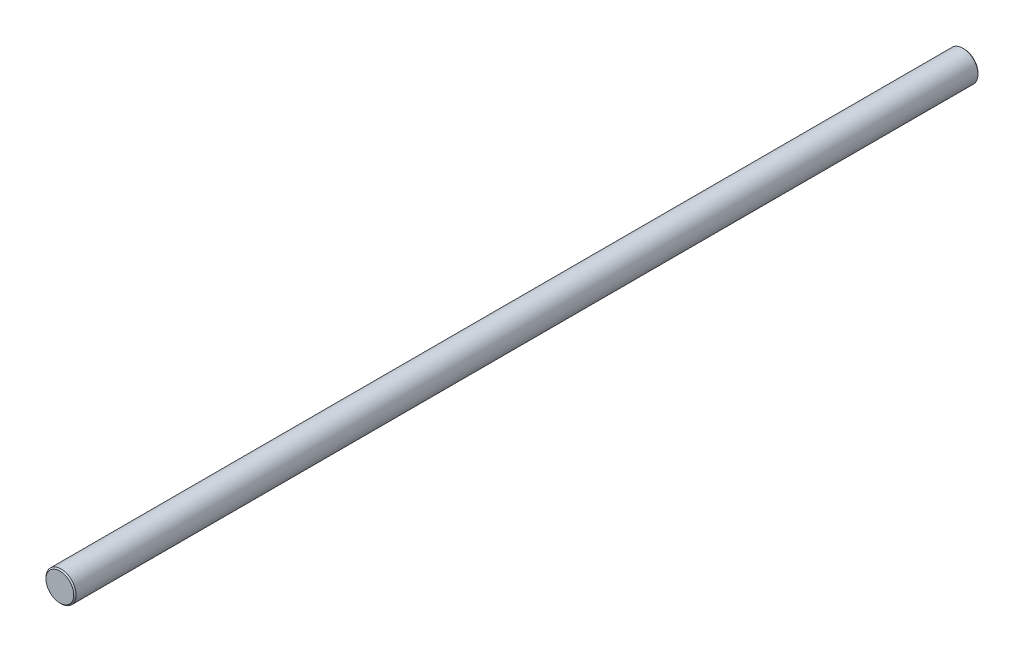
ISO-10303-21;
HEADER;
FILE_DESCRIPTION(('STEP AP214'),'2;1');
FILE_NAME('part.step','',(''),(''),'','','');
FILE_SCHEMA(('AUTOMOTIVE_DESIGN { 1 0 10303 214 1 1 1 1 }'));
ENDSEC;
DATA;
#1=APPLICATION_CONTEXT('core data for automotive mechanical design processes');
#2=APPLICATION_PROTOCOL_DEFINITION('international standard','automotive_design',2000,#1);
#3=PRODUCT_CONTEXT('',#1,'mechanical');
#4=PRODUCT('Part','Part','',(#3));
#5=PRODUCT_RELATED_PRODUCT_CATEGORY('part','',(#4));
#6=PRODUCT_DEFINITION_FORMATION('','',#4);
#7=PRODUCT_DEFINITION_CONTEXT('part definition',#1,'design');
#8=PRODUCT_DEFINITION('design','',#6,#7);
#9=PRODUCT_DEFINITION_SHAPE('','',#8);
#10=(LENGTH_UNIT() NAMED_UNIT(*) SI_UNIT(.MILLI.,.METRE.));
#11=(NAMED_UNIT(*) PLANE_ANGLE_UNIT() SI_UNIT($,.RADIAN.));
#12=(NAMED_UNIT(*) SI_UNIT($,.STERADIAN.) SOLID_ANGLE_UNIT());
#13=UNCERTAINTY_MEASURE_WITH_UNIT(LENGTH_MEASURE(1.E-05),#10,'distance_accuracy_value','');
#14=(GEOMETRIC_REPRESENTATION_CONTEXT(3) GLOBAL_UNCERTAINTY_ASSIGNED_CONTEXT((#13)) GLOBAL_UNIT_ASSIGNED_CONTEXT((#10,
#11,#12)) REPRESENTATION_CONTEXT('',''));
#15=CARTESIAN_POINT('',(0.,0.,0.));
#16=DIRECTION('',(0.,0.,1.));
#17=DIRECTION('',(1.,0.,0.));
#18=AXIS2_PLACEMENT_3D('',#15,#16,#17);
#19=CARTESIAN_POINT('',(0.,0.,375.));
#20=DIRECTION('',(0.,0.,-1.));
#21=DIRECTION('',(-1.,0.,0.));
#22=AXIS2_PLACEMENT_3D('',#19,#20,#21);
#23=CYLINDRICAL_SURFACE('',#22,12.5);
#24=CARTESIAN_POINT('',(0.,0.,-374.));
#25=DIRECTION('',(0.,0.,1.));
#26=DIRECTION('',(1.,0.,0.));
#27=AXIS2_PLACEMENT_3D('',#24,#25,#26);
#28=CIRCLE('',#27,12.5);
#29=CARTESIAN_POINT('',(12.5,0.,-374.));
#30=VERTEX_POINT('',#29);
#31=EDGE_CURVE('E43',#30,#30,#28,.T.);
#32=ORIENTED_EDGE('',*,*,#31,.T.);
#33=EDGE_LOOP('',(#32));
#34=FACE_BOUND('',#33,.T.);
#35=CARTESIAN_POINT('',(0.,0.,374.));
#36=DIRECTION('',(0.,0.,1.));
#37=DIRECTION('',(1.,0.,0.));
#38=AXIS2_PLACEMENT_3D('',#35,#36,#37);
#39=CIRCLE('',#38,12.5);
#40=CARTESIAN_POINT('',(12.5,0.,374.));
#41=VERTEX_POINT('',#40);
#42=EDGE_CURVE('E47',#41,#41,#39,.F.);
#43=ORIENTED_EDGE('',*,*,#42,.T.);
#44=EDGE_LOOP('',(#43));
#45=FACE_BOUND('',#44,.T.);
#46=ADVANCED_FACE('F32',(#34,#45),#23,.T.);
#47=CARTESIAN_POINT('',(0.,0.,375.));
#48=DIRECTION('',(0.,0.,1.));
#49=DIRECTION('',(1.,0.,0.));
#50=AXIS2_PLACEMENT_3D('',#47,#48,#49);
#51=PLANE('',#50);
#52=CARTESIAN_POINT('',(0.,0.,375.));
#53=DIRECTION('',(0.,0.,1.));
#54=DIRECTION('',(1.,0.,0.));
#55=AXIS2_PLACEMENT_3D('',#52,#53,#54);
#56=CIRCLE('',#55,11.4999999999998);
#57=CARTESIAN_POINT('',(11.4999999999998,0.,375.));
#58=VERTEX_POINT('',#57);
#59=EDGE_CURVE('E10',#58,#58,#56,.T.);
#60=ORIENTED_EDGE('',*,*,#59,.T.);
#61=EDGE_LOOP('',(#60));
#62=FACE_BOUND('',#61,.T.);
#63=ADVANCED_FACE('F63',(#62),#51,.T.);
#64=CARTESIAN_POINT('',(0.,0.,-375.));
#65=DIRECTION('',(0.,0.,1.));
#66=DIRECTION('',(1.,0.,0.));
#67=AXIS2_PLACEMENT_3D('',#64,#65,#66);
#68=PLANE('',#67);
#69=CARTESIAN_POINT('',(0.,0.,-375.));
#70=DIRECTION('',(0.,0.,1.));
#71=DIRECTION('',(1.,0.,0.));
#72=AXIS2_PLACEMENT_3D('',#69,#70,#71);
#73=CIRCLE('',#72,11.5);
#74=CARTESIAN_POINT('',(11.5,0.,-375.));
#75=VERTEX_POINT('',#74);
#76=EDGE_CURVE('E39',#75,#75,#73,.F.);
#77=ORIENTED_EDGE('',*,*,#76,.T.);
#78=EDGE_LOOP('',(#77));
#79=FACE_BOUND('',#78,.T.);
#80=ADVANCED_FACE('F60',(#79),#68,.F.);
#81=CARTESIAN_POINT('',(0.,0.,-374.));
#82=DIRECTION('',(0.,0.,1.));
#83=DIRECTION('',(1.,0.,0.));
#84=AXIS2_PLACEMENT_3D('',#81,#82,#83);
#85=CONICAL_SURFACE('',#84,12.5,0.785398163397471);
#86=ORIENTED_EDGE('',*,*,#76,.F.);
#87=EDGE_LOOP('',(#86));
#88=FACE_BOUND('',#87,.T.);
#89=ORIENTED_EDGE('',*,*,#31,.F.);
#90=EDGE_LOOP('',(#89));
#91=FACE_BOUND('',#90,.T.);
#92=ADVANCED_FACE('F56',(#88,#91),#85,.T.);
#93=CARTESIAN_POINT('',(0.,0.,375.));
#94=DIRECTION('',(0.,0.,-1.));
#95=DIRECTION('',(-1.,0.,0.));
#96=AXIS2_PLACEMENT_3D('',#93,#94,#95);
#97=CONICAL_SURFACE('',#96,11.4999999999998,0.785398163397471);
#98=ORIENTED_EDGE('',*,*,#42,.F.);
#99=EDGE_LOOP('',(#98));
#100=FACE_BOUND('',#99,.T.);
#101=ORIENTED_EDGE('',*,*,#59,.F.);
#102=EDGE_LOOP('',(#101));
#103=FACE_BOUND('',#102,.T.);
#104=ADVANCED_FACE('F34',(#100,#103),#97,.T.);
#105=CLOSED_SHELL('',(#46,#63,#80,#92,#104));
#106=MANIFOLD_SOLID_BREP('B2',#105);
#107=ADVANCED_BREP_SHAPE_REPRESENTATION('',(#18,#106),#14);
#108=SHAPE_DEFINITION_REPRESENTATION(#9,#107);
ENDSEC;
END-ISO-10303-21;
